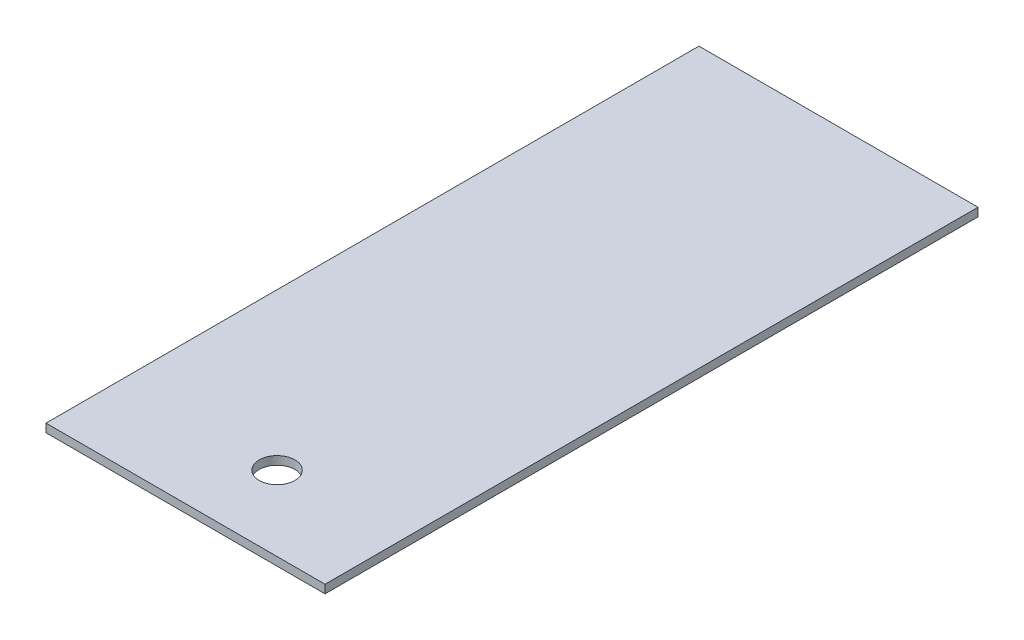
ISO-10303-21;
HEADER;
FILE_DESCRIPTION(('STEP AP214'),'2;1');
FILE_NAME('part.step','',(''),(''),'','','');
FILE_SCHEMA(('AUTOMOTIVE_DESIGN { 1 0 10303 214 1 1 1 1 }'));
ENDSEC;
DATA;
#1=APPLICATION_CONTEXT('core data for automotive mechanical design processes');
#2=APPLICATION_PROTOCOL_DEFINITION('international standard','automotive_design',2000,#1);
#3=PRODUCT_CONTEXT('',#1,'mechanical');
#4=PRODUCT('Part','Part','',(#3));
#5=PRODUCT_RELATED_PRODUCT_CATEGORY('part','',(#4));
#6=PRODUCT_DEFINITION_FORMATION('','',#4);
#7=PRODUCT_DEFINITION_CONTEXT('part definition',#1,'design');
#8=PRODUCT_DEFINITION('design','',#6,#7);
#9=PRODUCT_DEFINITION_SHAPE('','',#8);
#10=(LENGTH_UNIT() NAMED_UNIT(*) SI_UNIT(.MILLI.,.METRE.));
#11=(NAMED_UNIT(*) PLANE_ANGLE_UNIT() SI_UNIT($,.RADIAN.));
#12=(NAMED_UNIT(*) SI_UNIT($,.STERADIAN.) SOLID_ANGLE_UNIT());
#13=UNCERTAINTY_MEASURE_WITH_UNIT(LENGTH_MEASURE(1.E-05),#10,'distance_accuracy_value','');
#14=(GEOMETRIC_REPRESENTATION_CONTEXT(3) GLOBAL_UNCERTAINTY_ASSIGNED_CONTEXT((#13)) GLOBAL_UNIT_ASSIGNED_CONTEXT((#10,
#11,#12)) REPRESENTATION_CONTEXT('',''));
#15=CARTESIAN_POINT('',(0.,0.,0.));
#16=DIRECTION('',(0.,0.,1.));
#17=DIRECTION('',(1.,0.,0.));
#18=AXIS2_PLACEMENT_3D('',#15,#16,#17);
#19=CARTESIAN_POINT('',(0.,1.905,0.));
#20=DIRECTION('',(1.,0.,0.));
#21=DIRECTION('',(0.,0.,-1.));
#22=AXIS2_PLACEMENT_3D('',#19,#20,#21);
#23=PLANE('',#22);
#24=DIRECTION('',(0.,0.,1.));
#25=VECTOR('',#24,1.);
#26=CARTESIAN_POINT('',(0.,0.,0.));
#27=LINE('',#26,#25);
#28=CARTESIAN_POINT('',(0.,0.,-148.59));
#29=VERTEX_POINT('',#28);
#30=CARTESIAN_POINT('',(0.,0.,0.));
#31=VERTEX_POINT('',#30);
#32=EDGE_CURVE('E113',#29,#31,#27,.T.);
#33=ORIENTED_EDGE('',*,*,#32,.T.);
#34=DIRECTION('',(0.,-1.,0.));
#35=VECTOR('',#34,1.);
#36=CARTESIAN_POINT('',(0.,1.905,0.));
#37=LINE('',#36,#35);
#38=CARTESIAN_POINT('',(0.,1.905,0.));
#39=VERTEX_POINT('',#38);
#40=EDGE_CURVE('E11',#39,#31,#37,.T.);
#41=ORIENTED_EDGE('',*,*,#40,.F.);
#42=DIRECTION('',(0.,0.,1.));
#43=VECTOR('',#42,1.);
#44=CARTESIAN_POINT('',(0.,1.905,0.));
#45=LINE('',#44,#43);
#46=CARTESIAN_POINT('',(0.,1.905,-148.59));
#47=VERTEX_POINT('',#46);
#48=EDGE_CURVE('E96',#47,#39,#45,.T.);
#49=ORIENTED_EDGE('',*,*,#48,.F.);
#50=DIRECTION('',(0.,-1.,0.));
#51=VECTOR('',#50,1.);
#52=CARTESIAN_POINT('',(0.,1.905,-148.59));
#53=LINE('',#52,#51);
#54=EDGE_CURVE('E109',#47,#29,#53,.T.);
#55=ORIENTED_EDGE('',*,*,#54,.T.);
#56=EDGE_LOOP('',(#33,#41,#49,#55));
#57=FACE_BOUND('',#56,.T.);
#58=ADVANCED_FACE('F43',(#57),#23,.F.);
#59=CARTESIAN_POINT('',(0.,1.905,0.));
#60=DIRECTION('',(0.,0.,-1.));
#61=DIRECTION('',(-1.,0.,0.));
#62=AXIS2_PLACEMENT_3D('',#59,#60,#61);
#63=PLANE('',#62);
#64=DIRECTION('',(1.,0.,0.));
#65=VECTOR('',#64,1.);
#66=CARTESIAN_POINT('',(0.,0.,0.));
#67=LINE('',#66,#65);
#68=CARTESIAN_POINT('',(63.5,0.,0.));
#69=VERTEX_POINT('',#68);
#70=EDGE_CURVE('E101',#31,#69,#67,.T.);
#71=ORIENTED_EDGE('',*,*,#70,.T.);
#72=DIRECTION('',(0.,-1.,0.));
#73=VECTOR('',#72,1.);
#74=CARTESIAN_POINT('',(63.5,1.905,0.));
#75=LINE('',#74,#73);
#76=CARTESIAN_POINT('',(63.5,1.905,0.));
#77=VERTEX_POINT('',#76);
#78=EDGE_CURVE('E53',#77,#69,#75,.T.);
#79=ORIENTED_EDGE('',*,*,#78,.F.);
#80=DIRECTION('',(1.,0.,0.));
#81=VECTOR('',#80,1.);
#82=CARTESIAN_POINT('',(0.,1.905,0.));
#83=LINE('',#82,#81);
#84=EDGE_CURVE('E91',#39,#77,#83,.T.);
#85=ORIENTED_EDGE('',*,*,#84,.F.);
#86=ORIENTED_EDGE('',*,*,#40,.T.);
#87=EDGE_LOOP('',(#71,#79,#85,#86));
#88=FACE_BOUND('',#87,.T.);
#89=ADVANCED_FACE('F100',(#88),#63,.F.);
#90=CARTESIAN_POINT('',(63.5,1.905,0.));
#91=DIRECTION('',(-1.,0.,0.));
#92=DIRECTION('',(0.,0.,1.));
#93=AXIS2_PLACEMENT_3D('',#90,#91,#92);
#94=PLANE('',#93);
#95=DIRECTION('',(0.,0.,-1.));
#96=VECTOR('',#95,1.);
#97=CARTESIAN_POINT('',(63.5,0.,0.));
#98=LINE('',#97,#96);
#99=CARTESIAN_POINT('',(63.5,0.,-148.59));
#100=VERTEX_POINT('',#99);
#101=EDGE_CURVE('E78',#69,#100,#98,.T.);
#102=ORIENTED_EDGE('',*,*,#101,.T.);
#103=DIRECTION('',(0.,-1.,0.));
#104=VECTOR('',#103,1.);
#105=CARTESIAN_POINT('',(63.5,1.905,-148.59));
#106=LINE('',#105,#104);
#107=CARTESIAN_POINT('',(63.5,1.905,-148.59));
#108=VERTEX_POINT('',#107);
#109=EDGE_CURVE('E103',#108,#100,#106,.T.);
#110=ORIENTED_EDGE('',*,*,#109,.F.);
#111=DIRECTION('',(0.,0.,-1.));
#112=VECTOR('',#111,1.);
#113=CARTESIAN_POINT('',(63.5,1.905,0.));
#114=LINE('',#113,#112);
#115=EDGE_CURVE('E94',#77,#108,#114,.T.);
#116=ORIENTED_EDGE('',*,*,#115,.F.);
#117=ORIENTED_EDGE('',*,*,#78,.T.);
#118=EDGE_LOOP('',(#102,#110,#116,#117));
#119=FACE_BOUND('',#118,.T.);
#120=ADVANCED_FACE('F105',(#119),#94,.F.);
#121=CARTESIAN_POINT('',(0.,1.905,-148.59));
#122=DIRECTION('',(0.,0.,1.));
#123=DIRECTION('',(1.,0.,0.));
#124=AXIS2_PLACEMENT_3D('',#121,#122,#123);
#125=PLANE('',#124);
#126=DIRECTION('',(-1.,0.,0.));
#127=VECTOR('',#126,1.);
#128=CARTESIAN_POINT('',(0.,0.,-148.59));
#129=LINE('',#128,#127);
#130=EDGE_CURVE('E84',#100,#29,#129,.T.);
#131=ORIENTED_EDGE('',*,*,#130,.T.);
#132=ORIENTED_EDGE('',*,*,#54,.F.);
#133=DIRECTION('',(-1.,0.,0.));
#134=VECTOR('',#133,1.);
#135=CARTESIAN_POINT('',(0.,1.905,-148.59));
#136=LINE('',#135,#134);
#137=EDGE_CURVE('E61',#108,#47,#136,.T.);
#138=ORIENTED_EDGE('',*,*,#137,.F.);
#139=ORIENTED_EDGE('',*,*,#109,.T.);
#140=EDGE_LOOP('',(#131,#132,#138,#139));
#141=FACE_BOUND('',#140,.T.);
#142=ADVANCED_FACE('F126',(#141),#125,.F.);
#143=CARTESIAN_POINT('',(0.,1.905,0.));
#144=DIRECTION('',(0.,-1.,0.));
#145=DIRECTION('',(0.,0.,-1.));
#146=AXIS2_PLACEMENT_3D('',#143,#144,#145);
#147=PLANE('',#146);
#148=CARTESIAN_POINT('',(35.56,1.905,-17.018));
#149=DIRECTION('',(0.,1.,0.));
#150=DIRECTION('',(0.,0.,1.));
#151=AXIS2_PLACEMENT_3D('',#148,#149,#150);
#152=CIRCLE('',#151,4.06400000000001);
#153=CARTESIAN_POINT('',(35.56,1.905,-12.954));
#154=VERTEX_POINT('',#153);
#155=EDGE_CURVE('E133',#154,#154,#152,.T.);
#156=ORIENTED_EDGE('',*,*,#155,.F.);
#157=EDGE_LOOP('',(#156));
#158=FACE_BOUND('',#157,.T.);
#159=ORIENTED_EDGE('',*,*,#48,.T.);
#160=ORIENTED_EDGE('',*,*,#84,.T.);
#161=ORIENTED_EDGE('',*,*,#115,.T.);
#162=ORIENTED_EDGE('',*,*,#137,.T.);
#163=EDGE_LOOP('',(#159,#160,#161,#162));
#164=FACE_BOUND('',#163,.T.);
#165=ADVANCED_FACE('F92',(#158,#164),#147,.F.);
#166=CARTESIAN_POINT('',(0.,0.,0.));
#167=DIRECTION('',(0.,-1.,0.));
#168=DIRECTION('',(0.,0.,-1.));
#169=AXIS2_PLACEMENT_3D('',#166,#167,#168);
#170=PLANE('',#169);
#171=CARTESIAN_POINT('',(35.56,0.,-17.018));
#172=DIRECTION('',(0.,-1.,0.));
#173=DIRECTION('',(0.,0.,-1.));
#174=AXIS2_PLACEMENT_3D('',#171,#172,#173);
#175=CIRCLE('',#174,4.06400000000001);
#176=CARTESIAN_POINT('',(35.56,0.,-21.082));
#177=VERTEX_POINT('',#176);
#178=EDGE_CURVE('E46',#177,#177,#175,.T.);
#179=ORIENTED_EDGE('',*,*,#178,.F.);
#180=EDGE_LOOP('',(#179));
#181=FACE_BOUND('',#180,.T.);
#182=ORIENTED_EDGE('',*,*,#32,.F.);
#183=ORIENTED_EDGE('',*,*,#130,.F.);
#184=ORIENTED_EDGE('',*,*,#101,.F.);
#185=ORIENTED_EDGE('',*,*,#70,.F.);
#186=EDGE_LOOP('',(#182,#183,#184,#185));
#187=FACE_BOUND('',#186,.T.);
#188=ADVANCED_FACE('F129',(#181,#187),#170,.T.);
#189=CARTESIAN_POINT('',(35.56,-0.635,-17.018));
#190=DIRECTION('',(0.,1.,0.));
#191=DIRECTION('',(0.,0.,1.));
#192=AXIS2_PLACEMENT_3D('',#189,#190,#191);
#193=CYLINDRICAL_SURFACE('',#192,4.06400000000001);
#194=ORIENTED_EDGE('',*,*,#178,.T.);
#195=EDGE_LOOP('',(#194));
#196=FACE_BOUND('',#195,.T.);
#197=ORIENTED_EDGE('',*,*,#155,.T.);
#198=EDGE_LOOP('',(#197));
#199=FACE_BOUND('',#198,.T.);
#200=ADVANCED_FACE('F142',(#196,#199),#193,.F.);
#201=CLOSED_SHELL('',(#58,#89,#120,#142,#165,#188,#200));
#202=MANIFOLD_SOLID_BREP('B2',#201);
#203=ADVANCED_BREP_SHAPE_REPRESENTATION('',(#18,#202),#14);
#204=SHAPE_DEFINITION_REPRESENTATION(#9,#203);
ENDSEC;
END-ISO-10303-21;
